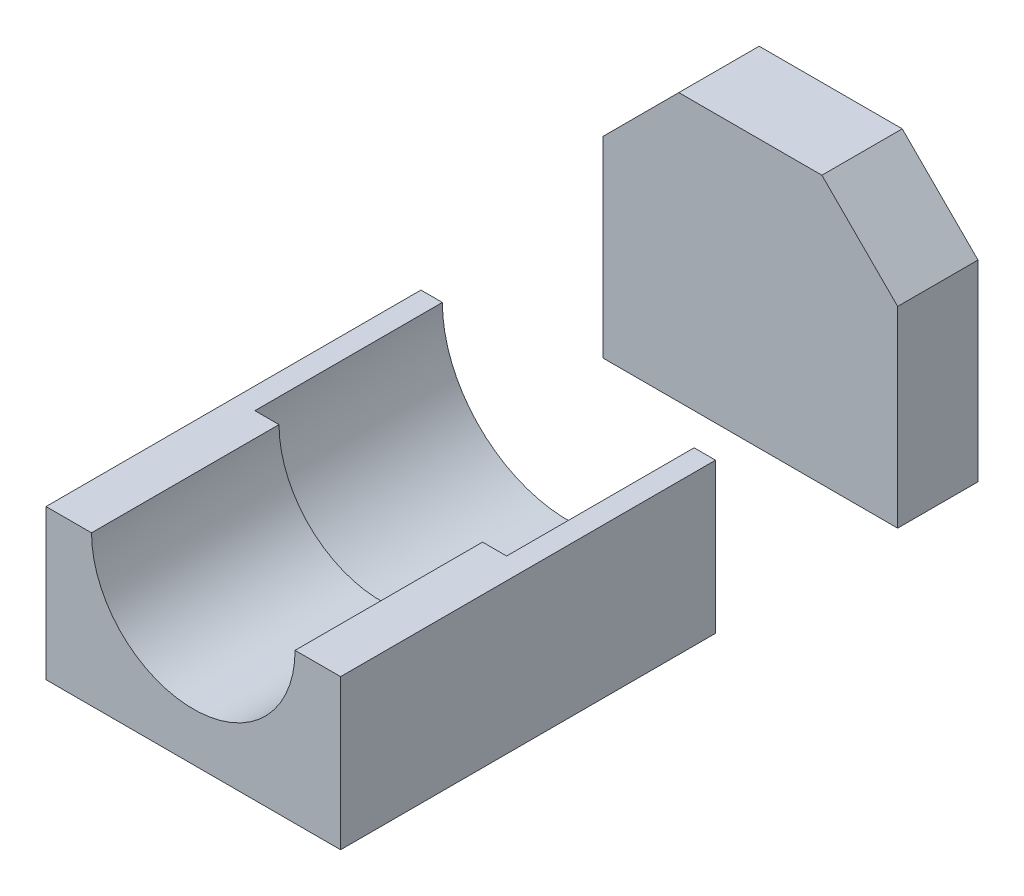
ISO-10303-21;
HEADER;
FILE_DESCRIPTION(('STEP AP214'),'2;1');
FILE_NAME('part.step','',(''),(''),'','','');
FILE_SCHEMA(('AUTOMOTIVE_DESIGN { 1 0 10303 214 1 1 1 1 }'));
ENDSEC;
DATA;
#1=APPLICATION_CONTEXT('core data for automotive mechanical design processes');
#2=APPLICATION_PROTOCOL_DEFINITION('international standard','automotive_design',2000,#1);
#3=PRODUCT_CONTEXT('',#1,'mechanical');
#4=PRODUCT('Part','Part','',(#3));
#5=PRODUCT_RELATED_PRODUCT_CATEGORY('part','',(#4));
#6=PRODUCT_DEFINITION_FORMATION('','',#4);
#7=PRODUCT_DEFINITION_CONTEXT('part definition',#1,'design');
#8=PRODUCT_DEFINITION('design','',#6,#7);
#9=PRODUCT_DEFINITION_SHAPE('','',#8);
#10=(LENGTH_UNIT() NAMED_UNIT(*) SI_UNIT(.MILLI.,.METRE.));
#11=(NAMED_UNIT(*) PLANE_ANGLE_UNIT() SI_UNIT($,.RADIAN.));
#12=(NAMED_UNIT(*) SI_UNIT($,.STERADIAN.) SOLID_ANGLE_UNIT());
#13=UNCERTAINTY_MEASURE_WITH_UNIT(LENGTH_MEASURE(1.E-05),#10,'distance_accuracy_value','');
#14=(GEOMETRIC_REPRESENTATION_CONTEXT(3) GLOBAL_UNCERTAINTY_ASSIGNED_CONTEXT((#13)) GLOBAL_UNIT_ASSIGNED_CONTEXT((#10,
#11,#12)) REPRESENTATION_CONTEXT('',''));
#15=CARTESIAN_POINT('',(0.,0.,0.));
#16=DIRECTION('',(0.,0.,1.));
#17=DIRECTION('',(1.,0.,0.));
#18=AXIS2_PLACEMENT_3D('',#15,#16,#17);
#19=CARTESIAN_POINT('',(44.7489418291473,23.7901192371777,-49.));
#20=DIRECTION('',(1.,0.,0.));
#21=DIRECTION('',(0.,0.,-1.));
#22=AXIS2_PLACEMENT_3D('',#19,#20,#21);
#23=PLANE('',#22);
#24=DIRECTION('',(0.,1.,0.));
#25=VECTOR('',#24,1.);
#26=CARTESIAN_POINT('',(44.7489418291473,23.7901192371777,-34.));
#27=LINE('',#26,#25);
#28=CARTESIAN_POINT('',(44.7489418291473,-12.0677451390913,-34.));
#29=VERTEX_POINT('',#28);
#30=CARTESIAN_POINT('',(44.7489418291473,23.7901192371777,-34.));
#31=VERTEX_POINT('',#30);
#32=EDGE_CURVE('E137',#29,#31,#27,.T.);
#33=ORIENTED_EDGE('',*,*,#32,.T.);
#34=DIRECTION('',(0.,0.,1.));
#35=VECTOR('',#34,1.);
#36=CARTESIAN_POINT('',(44.7489418291473,23.7901192371777,-49.));
#37=LINE('',#36,#35);
#38=CARTESIAN_POINT('',(44.7489418291473,23.7901192371777,-49.));
#39=VERTEX_POINT('',#38);
#40=EDGE_CURVE('E57',#39,#31,#37,.T.);
#41=ORIENTED_EDGE('',*,*,#40,.F.);
#42=DIRECTION('',(0.,1.,0.));
#43=VECTOR('',#42,1.);
#44=CARTESIAN_POINT('',(44.7489418291473,23.7901192371777,-49.));
#45=LINE('',#44,#43);
#46=CARTESIAN_POINT('',(44.7489418291473,-12.0677451390913,-49.));
#47=VERTEX_POINT('',#46);
#48=EDGE_CURVE('E103',#47,#39,#45,.T.);
#49=ORIENTED_EDGE('',*,*,#48,.F.);
#50=DIRECTION('',(0.,0.,1.));
#51=VECTOR('',#50,1.);
#52=CARTESIAN_POINT('',(44.7489418291473,-12.0677451390913,-49.));
#53=LINE('',#52,#51);
#54=EDGE_CURVE('E12',#47,#29,#53,.T.);
#55=ORIENTED_EDGE('',*,*,#54,.T.);
#56=EDGE_LOOP('',(#33,#41,#49,#55));
#57=FACE_BOUND('',#56,.T.);
#58=ADVANCED_FACE('F49',(#57),#23,.F.);
#59=CARTESIAN_POINT('',(58.8910774528783,37.9322548609087,-49.));
#60=DIRECTION('',(0.707106781186546,-0.707106781186549,0.));
#61=DIRECTION('',(0.707106781186549,0.707106781186546,0.));
#62=AXIS2_PLACEMENT_3D('',#59,#60,#61);
#63=PLANE('',#62);
#64=DIRECTION('',(0.707106781186549,0.707106781186546,0.));
#65=VECTOR('',#64,1.);
#66=CARTESIAN_POINT('',(58.8910774528783,37.9322548609087,-34.));
#67=LINE('',#66,#65);
#68=CARTESIAN_POINT('',(58.8910774528783,37.9322548609087,-34.));
#69=VERTEX_POINT('',#68);
#70=EDGE_CURVE('E139',#31,#69,#67,.T.);
#71=ORIENTED_EDGE('',*,*,#70,.T.);
#72=DIRECTION('',(0.,0.,1.));
#73=VECTOR('',#72,1.);
#74=CARTESIAN_POINT('',(58.8910774528783,37.9322548609087,-49.));
#75=LINE('',#74,#73);
#76=CARTESIAN_POINT('',(58.8910774528783,37.9322548609087,-49.));
#77=VERTEX_POINT('',#76);
#78=EDGE_CURVE('E126',#77,#69,#75,.T.);
#79=ORIENTED_EDGE('',*,*,#78,.F.);
#80=DIRECTION('',(0.707106781186549,0.707106781186546,0.));
#81=VECTOR('',#80,1.);
#82=CARTESIAN_POINT('',(58.8910774528783,37.9322548609087,-49.));
#83=LINE('',#82,#81);
#84=EDGE_CURVE('E117',#39,#77,#83,.T.);
#85=ORIENTED_EDGE('',*,*,#84,.F.);
#86=ORIENTED_EDGE('',*,*,#40,.T.);
#87=EDGE_LOOP('',(#71,#79,#85,#86));
#88=FACE_BOUND('',#87,.T.);
#89=ADVANCED_FACE('F151',(#88),#63,.F.);
#90=CARTESIAN_POINT('',(85.6068062054163,37.9322548609087,-49.));
#91=DIRECTION('',(0.,-1.,0.));
#92=DIRECTION('',(0.,0.,-1.));
#93=AXIS2_PLACEMENT_3D('',#90,#91,#92);
#94=PLANE('',#93);
#95=DIRECTION('',(1.,0.,0.));
#96=VECTOR('',#95,1.);
#97=CARTESIAN_POINT('',(85.6068062054163,37.9322548609087,-34.));
#98=LINE('',#97,#96);
#99=CARTESIAN_POINT('',(85.6068062054163,37.9322548609087,-34.));
#100=VERTEX_POINT('',#99);
#101=EDGE_CURVE('E125',#69,#100,#98,.T.);
#102=ORIENTED_EDGE('',*,*,#101,.T.);
#103=DIRECTION('',(0.,0.,1.));
#104=VECTOR('',#103,1.);
#105=CARTESIAN_POINT('',(85.6068062054163,37.9322548609087,-49.));
#106=LINE('',#105,#104);
#107=CARTESIAN_POINT('',(85.6068062054163,37.9322548609087,-49.));
#108=VERTEX_POINT('',#107);
#109=EDGE_CURVE('E122',#108,#100,#106,.T.);
#110=ORIENTED_EDGE('',*,*,#109,.F.);
#111=DIRECTION('',(1.,0.,0.));
#112=VECTOR('',#111,1.);
#113=CARTESIAN_POINT('',(85.6068062054163,37.9322548609087,-49.));
#114=LINE('',#113,#112);
#115=EDGE_CURVE('E111',#77,#108,#114,.T.);
#116=ORIENTED_EDGE('',*,*,#115,.F.);
#117=ORIENTED_EDGE('',*,*,#78,.T.);
#118=EDGE_LOOP('',(#102,#110,#116,#117));
#119=FACE_BOUND('',#118,.T.);
#120=ADVANCED_FACE('F123',(#119),#94,.F.);
#121=CARTESIAN_POINT('',(99.7489418291473,23.7901192371777,-49.));
#122=DIRECTION('',(-0.707106781186546,-0.707106781186549,0.));
#123=DIRECTION('',(0.707106781186549,-0.707106781186546,0.));
#124=AXIS2_PLACEMENT_3D('',#121,#122,#123);
#125=PLANE('',#124);
#126=DIRECTION('',(0.707106781186549,-0.707106781186545,0.));
#127=VECTOR('',#126,1.);
#128=CARTESIAN_POINT('',(99.7489418291473,23.7901192371777,-34.));
#129=LINE('',#128,#127);
#130=CARTESIAN_POINT('',(99.7489418291473,23.7901192371777,-34.));
#131=VERTEX_POINT('',#130);
#132=EDGE_CURVE('E89',#100,#131,#129,.T.);
#133=ORIENTED_EDGE('',*,*,#132,.T.);
#134=DIRECTION('',(0.,0.,1.));
#135=VECTOR('',#134,1.);
#136=CARTESIAN_POINT('',(99.7489418291473,23.7901192371777,-49.));
#137=LINE('',#136,#135);
#138=CARTESIAN_POINT('',(99.7489418291473,23.7901192371777,-49.));
#139=VERTEX_POINT('',#138);
#140=EDGE_CURVE('E127',#139,#131,#137,.T.);
#141=ORIENTED_EDGE('',*,*,#140,.F.);
#142=DIRECTION('',(0.707106781186549,-0.707106781186545,0.));
#143=VECTOR('',#142,1.);
#144=CARTESIAN_POINT('',(99.7489418291473,23.7901192371777,-49.));
#145=LINE('',#144,#143);
#146=EDGE_CURVE('E115',#108,#139,#145,.T.);
#147=ORIENTED_EDGE('',*,*,#146,.F.);
#148=ORIENTED_EDGE('',*,*,#109,.T.);
#149=EDGE_LOOP('',(#133,#141,#147,#148));
#150=FACE_BOUND('',#149,.T.);
#151=ADVANCED_FACE('F129',(#150),#125,.F.);
#152=CARTESIAN_POINT('',(99.7489418291473,-12.0677451390913,-49.));
#153=DIRECTION('',(-1.,0.,0.));
#154=DIRECTION('',(0.,0.,1.));
#155=AXIS2_PLACEMENT_3D('',#152,#153,#154);
#156=PLANE('',#155);
#157=DIRECTION('',(0.,-1.,0.));
#158=VECTOR('',#157,1.);
#159=CARTESIAN_POINT('',(99.7489418291473,-12.0677451390913,-34.));
#160=LINE('',#159,#158);
#161=CARTESIAN_POINT('',(99.7489418291473,-12.0677451390913,-34.));
#162=VERTEX_POINT('',#161);
#163=EDGE_CURVE('E96',#131,#162,#160,.T.);
#164=ORIENTED_EDGE('',*,*,#163,.T.);
#165=DIRECTION('',(0.,0.,1.));
#166=VECTOR('',#165,1.);
#167=CARTESIAN_POINT('',(99.7489418291473,-12.0677451390913,-49.));
#168=LINE('',#167,#166);
#169=CARTESIAN_POINT('',(99.7489418291473,-12.0677451390913,-49.));
#170=VERTEX_POINT('',#169);
#171=EDGE_CURVE('E133',#170,#162,#168,.T.);
#172=ORIENTED_EDGE('',*,*,#171,.F.);
#173=DIRECTION('',(0.,-1.,0.));
#174=VECTOR('',#173,1.);
#175=CARTESIAN_POINT('',(99.7489418291473,-12.0677451390913,-49.));
#176=LINE('',#175,#174);
#177=EDGE_CURVE('E131',#139,#170,#176,.T.);
#178=ORIENTED_EDGE('',*,*,#177,.F.);
#179=ORIENTED_EDGE('',*,*,#140,.T.);
#180=EDGE_LOOP('',(#164,#172,#178,#179));
#181=FACE_BOUND('',#180,.T.);
#182=ADVANCED_FACE('F157',(#181),#156,.F.);
#183=CARTESIAN_POINT('',(46.4162897695382,-12.0677451390913,-49.));
#184=DIRECTION('',(0.,1.,0.));
#185=DIRECTION('',(-1.,0.,0.));
#186=AXIS2_PLACEMENT_3D('',#183,#184,#185);
#187=PLANE('',#186);
#188=DIRECTION('',(-1.,0.,0.));
#189=VECTOR('',#188,1.);
#190=CARTESIAN_POINT('',(46.4162897695382,-12.0677451390913,-34.));
#191=LINE('',#190,#189);
#192=EDGE_CURVE('E144',#162,#29,#191,.T.);
#193=ORIENTED_EDGE('',*,*,#192,.T.);
#194=ORIENTED_EDGE('',*,*,#54,.F.);
#195=DIRECTION('',(-1.,0.,0.));
#196=VECTOR('',#195,1.);
#197=CARTESIAN_POINT('',(44.7489418291473,-12.0677451390913,-49.));
#198=LINE('',#197,#196);
#199=EDGE_CURVE('E65',#170,#47,#198,.T.);
#200=ORIENTED_EDGE('',*,*,#199,.F.);
#201=ORIENTED_EDGE('',*,*,#171,.T.);
#202=EDGE_LOOP('',(#193,#194,#200,#201));
#203=FACE_BOUND('',#202,.T.);
#204=ADVANCED_FACE('F156',(#203),#187,.F.);
#205=CARTESIAN_POINT('',(0.,0.,-49.));
#206=DIRECTION('',(0.,0.,1.));
#207=DIRECTION('',(1.,0.,0.));
#208=AXIS2_PLACEMENT_3D('',#205,#206,#207);
#209=PLANE('',#208);
#210=ORIENTED_EDGE('',*,*,#199,.T.);
#211=ORIENTED_EDGE('',*,*,#48,.T.);
#212=ORIENTED_EDGE('',*,*,#84,.T.);
#213=ORIENTED_EDGE('',*,*,#115,.T.);
#214=ORIENTED_EDGE('',*,*,#146,.T.);
#215=ORIENTED_EDGE('',*,*,#177,.T.);
#216=EDGE_LOOP('',(#210,#211,#212,#213,#214,#215));
#217=FACE_BOUND('',#216,.T.);
#218=ADVANCED_FACE('F113',(#217),#209,.F.);
#219=CARTESIAN_POINT('',(0.,0.,-34.));
#220=DIRECTION('',(0.,0.,1.));
#221=DIRECTION('',(1.,0.,0.));
#222=AXIS2_PLACEMENT_3D('',#219,#220,#221);
#223=PLANE('',#222);
#224=ORIENTED_EDGE('',*,*,#32,.F.);
#225=ORIENTED_EDGE('',*,*,#192,.F.);
#226=ORIENTED_EDGE('',*,*,#163,.F.);
#227=ORIENTED_EDGE('',*,*,#132,.F.);
#228=ORIENTED_EDGE('',*,*,#101,.F.);
#229=ORIENTED_EDGE('',*,*,#70,.F.);
#230=EDGE_LOOP('',(#224,#225,#226,#227,#228,#229));
#231=FACE_BOUND('',#230,.T.);
#232=ADVANCED_FACE('F154',(#231),#223,.T.);
#233=CLOSED_SHELL('',(#58,#89,#120,#151,#182,#204,#218,#232));
#234=MANIFOLD_SOLID_BREP('B2',#233);
#235=CARTESIAN_POINT('',(72.2489418291473,15.9322548609087,35.));
#236=DIRECTION('',(0.,0.,-1.));
#237=DIRECTION('',(-1.,0.,0.));
#238=AXIS2_PLACEMENT_3D('',#235,#236,#237);
#239=CYLINDRICAL_SURFACE('',#238,23.5);
#240=CARTESIAN_POINT('',(72.2489418291473,15.9322548609087,0.));
#241=DIRECTION('',(0.,0.,-1.));
#242=DIRECTION('',(-1.,0.,0.));
#243=AXIS2_PLACEMENT_3D('',#240,#241,#242);
#244=CIRCLE('',#243,23.5);
#245=CARTESIAN_POINT('',(95.7489418291473,15.9322548609085,0.));
#246=VERTEX_POINT('',#245);
#247=CARTESIAN_POINT('',(48.7489418291473,15.9322548609087,0.));
#248=VERTEX_POINT('',#247);
#249=EDGE_CURVE('E290',#246,#248,#244,.T.);
#250=ORIENTED_EDGE('',*,*,#249,.T.);
#251=DIRECTION('',(0.,0.,-1.));
#252=VECTOR('',#251,1.);
#253=CARTESIAN_POINT('',(48.7489418291473,15.9322548609087,35.));
#254=LINE('',#253,#252);
#255=CARTESIAN_POINT('',(48.7489418291473,15.9322548609087,35.));
#256=VERTEX_POINT('',#255);
#257=EDGE_CURVE('E47',#256,#248,#254,.T.);
#258=ORIENTED_EDGE('',*,*,#257,.F.);
#259=CARTESIAN_POINT('',(72.2489418291473,15.9322548609087,35.));
#260=DIRECTION('',(0.,0.,-1.));
#261=DIRECTION('',(-1.,0.,0.));
#262=AXIS2_PLACEMENT_3D('',#259,#260,#261);
#263=CIRCLE('',#262,23.5);
#264=CARTESIAN_POINT('',(95.7489418291473,15.9322548609085,35.));
#265=VERTEX_POINT('',#264);
#266=EDGE_CURVE('E291',#265,#256,#263,.T.);
#267=ORIENTED_EDGE('',*,*,#266,.F.);
#268=DIRECTION('',(0.,0.,-1.));
#269=VECTOR('',#268,1.);
#270=CARTESIAN_POINT('',(95.7489418291473,15.9322548609085,35.));
#271=LINE('',#270,#269);
#272=EDGE_CURVE('E243',#265,#246,#271,.T.);
#273=ORIENTED_EDGE('',*,*,#272,.T.);
#274=EDGE_LOOP('',(#250,#258,#267,#273));
#275=FACE_BOUND('',#274,.T.);
#276=ADVANCED_FACE('F228',(#275),#239,.F.);
#277=CARTESIAN_POINT('',(48.7489418291473,15.9322548609087,35.));
#278=DIRECTION('',(0.,-1.,0.));
#279=DIRECTION('',(0.,0.,-1.));
#280=AXIS2_PLACEMENT_3D('',#277,#278,#279);
#281=PLANE('',#280);
#282=DIRECTION('',(-1.,0.,0.));
#283=VECTOR('',#282,1.);
#284=CARTESIAN_POINT('',(48.7489418291473,15.9322548609087,0.));
#285=LINE('',#284,#283);
#286=CARTESIAN_POINT('',(44.7489418291473,15.9322548609087,0.));
#287=VERTEX_POINT('',#286);
#288=EDGE_CURVE('E315',#248,#287,#285,.T.);
#289=ORIENTED_EDGE('',*,*,#288,.T.);
#290=DIRECTION('',(0.,0.,-1.));
#291=VECTOR('',#290,1.);
#292=CARTESIAN_POINT('',(44.7489418291473,15.9322548609087,35.));
#293=LINE('',#292,#291);
#294=CARTESIAN_POINT('',(44.7489418291473,15.9322548609087,70.));
#295=VERTEX_POINT('',#294);
#296=EDGE_CURVE('E236',#295,#287,#293,.T.);
#297=ORIENTED_EDGE('',*,*,#296,.F.);
#298=DIRECTION('',(-1.,0.,0.));
#299=VECTOR('',#298,1.);
#300=CARTESIAN_POINT('',(44.7489418291473,15.9322548609087,70.));
#301=LINE('',#300,#299);
#302=CARTESIAN_POINT('',(53.2489418291473,15.9322548609087,70.));
#303=VERTEX_POINT('',#302);
#304=EDGE_CURVE('E342',#303,#295,#301,.T.);
#305=ORIENTED_EDGE('',*,*,#304,.F.);
#306=DIRECTION('',(0.,0.,-1.));
#307=VECTOR('',#306,1.);
#308=CARTESIAN_POINT('',(53.2489418291473,15.9322548609087,70.));
#309=LINE('',#308,#307);
#310=CARTESIAN_POINT('',(53.2489418291473,15.9322548609087,35.));
#311=VERTEX_POINT('',#310);
#312=EDGE_CURVE('E319',#303,#311,#309,.T.);
#313=ORIENTED_EDGE('',*,*,#312,.T.);
#314=DIRECTION('',(-1.,0.,0.));
#315=VECTOR('',#314,1.);
#316=CARTESIAN_POINT('',(44.7489418291473,15.9322548609087,35.));
#317=LINE('',#316,#315);
#318=EDGE_CURVE('E329',#311,#256,#317,.T.);
#319=ORIENTED_EDGE('',*,*,#318,.T.);
#320=ORIENTED_EDGE('',*,*,#257,.T.);
#321=EDGE_LOOP('',(#289,#297,#305,#313,#319,#320));
#322=FACE_BOUND('',#321,.T.);
#323=ADVANCED_FACE('F357',(#322),#281,.F.);
#324=CARTESIAN_POINT('',(44.7489418291473,15.9322548609087,35.));
#325=DIRECTION('',(1.,0.,0.));
#326=DIRECTION('',(0.,0.,-1.));
#327=AXIS2_PLACEMENT_3D('',#324,#325,#326);
#328=PLANE('',#327);
#329=DIRECTION('',(0.,-1.,0.));
#330=VECTOR('',#329,1.);
#331=CARTESIAN_POINT('',(44.7489418291473,15.9322548609087,0.));
#332=LINE('',#331,#330);
#333=CARTESIAN_POINT('',(44.7489418291473,-12.0677451390913,0.));
#334=VERTEX_POINT('',#333);
#335=EDGE_CURVE('E308',#287,#334,#332,.T.);
#336=ORIENTED_EDGE('',*,*,#335,.T.);
#337=DIRECTION('',(0.,0.,-1.));
#338=VECTOR('',#337,1.);
#339=CARTESIAN_POINT('',(44.7489418291473,-12.0677451390913,35.));
#340=LINE('',#339,#338);
#341=CARTESIAN_POINT('',(44.7489418291473,-12.0677451390913,70.));
#342=VERTEX_POINT('',#341);
#343=EDGE_CURVE('E299',#342,#334,#340,.T.);
#344=ORIENTED_EDGE('',*,*,#343,.F.);
#345=DIRECTION('',(0.,-1.,0.));
#346=VECTOR('',#345,1.);
#347=CARTESIAN_POINT('',(44.7489418291473,-12.0677451390913,70.));
#348=LINE('',#347,#346);
#349=EDGE_CURVE('E311',#295,#342,#348,.T.);
#350=ORIENTED_EDGE('',*,*,#349,.F.);
#351=ORIENTED_EDGE('',*,*,#296,.T.);
#352=EDGE_LOOP('',(#336,#344,#350,#351));
#353=FACE_BOUND('',#352,.T.);
#354=ADVANCED_FACE('F306',(#353),#328,.F.);
#355=CARTESIAN_POINT('',(44.7489418291473,-12.0677451390913,35.));
#356=DIRECTION('',(0.,1.,0.));
#357=DIRECTION('',(-1.,0.,0.));
#358=AXIS2_PLACEMENT_3D('',#355,#356,#357);
#359=PLANE('',#358);
#360=DIRECTION('',(1.,0.,0.));
#361=VECTOR('',#360,1.);
#362=CARTESIAN_POINT('',(44.7489418291473,-12.0677451390913,0.));
#363=LINE('',#362,#361);
#364=CARTESIAN_POINT('',(99.7489418291473,-12.0677451390913,0.));
#365=VERTEX_POINT('',#364);
#366=EDGE_CURVE('E279',#334,#365,#363,.T.);
#367=ORIENTED_EDGE('',*,*,#366,.T.);
#368=DIRECTION('',(0.,0.,-1.));
#369=VECTOR('',#368,1.);
#370=CARTESIAN_POINT('',(99.7489418291473,-12.0677451390913,35.));
#371=LINE('',#370,#369);
#372=CARTESIAN_POINT('',(99.7489418291473,-12.0677451390913,70.));
#373=VERTEX_POINT('',#372);
#374=EDGE_CURVE('E274',#373,#365,#371,.T.);
#375=ORIENTED_EDGE('',*,*,#374,.F.);
#376=DIRECTION('',(1.,0.,0.));
#377=VECTOR('',#376,1.);
#378=CARTESIAN_POINT('',(99.7489418291473,-12.0677451390913,70.));
#379=LINE('',#378,#377);
#380=EDGE_CURVE('E338',#342,#373,#379,.T.);
#381=ORIENTED_EDGE('',*,*,#380,.F.);
#382=ORIENTED_EDGE('',*,*,#343,.T.);
#383=EDGE_LOOP('',(#367,#375,#381,#382));
#384=FACE_BOUND('',#383,.T.);
#385=ADVANCED_FACE('F370',(#384),#359,.F.);
#386=CARTESIAN_POINT('',(99.7489418291473,-12.0677451390913,35.));
#387=DIRECTION('',(-1.,0.,0.));
#388=DIRECTION('',(0.,0.,1.));
#389=AXIS2_PLACEMENT_3D('',#386,#387,#388);
#390=PLANE('',#389);
#391=DIRECTION('',(0.,1.,0.));
#392=VECTOR('',#391,1.);
#393=CARTESIAN_POINT('',(99.7489418291473,-12.0677451390913,0.));
#394=LINE('',#393,#392);
#395=CARTESIAN_POINT('',(99.7489418291473,15.9322548609085,0.));
#396=VERTEX_POINT('',#395);
#397=EDGE_CURVE('E266',#365,#396,#394,.T.);
#398=ORIENTED_EDGE('',*,*,#397,.T.);
#399=DIRECTION('',(0.,0.,-1.));
#400=VECTOR('',#399,1.);
#401=CARTESIAN_POINT('',(99.7489418291473,15.9322548609085,35.));
#402=LINE('',#401,#400);
#403=CARTESIAN_POINT('',(99.7489418291473,15.9322548609085,70.));
#404=VERTEX_POINT('',#403);
#405=EDGE_CURVE('E271',#404,#396,#402,.T.);
#406=ORIENTED_EDGE('',*,*,#405,.F.);
#407=DIRECTION('',(0.,1.,0.));
#408=VECTOR('',#407,1.);
#409=CARTESIAN_POINT('',(99.7489418291473,15.9322548609085,70.));
#410=LINE('',#409,#408);
#411=EDGE_CURVE('E336',#373,#404,#410,.T.);
#412=ORIENTED_EDGE('',*,*,#411,.F.);
#413=ORIENTED_EDGE('',*,*,#374,.T.);
#414=EDGE_LOOP('',(#398,#406,#412,#413));
#415=FACE_BOUND('',#414,.T.);
#416=ADVANCED_FACE('F268',(#415),#390,.F.);
#417=CARTESIAN_POINT('',(99.7489418291473,15.9322548609085,35.));
#418=DIRECTION('',(0.,-1.,0.));
#419=DIRECTION('',(1.,0.,0.));
#420=AXIS2_PLACEMENT_3D('',#417,#418,#419);
#421=PLANE('',#420);
#422=DIRECTION('',(-1.,0.,0.));
#423=VECTOR('',#422,1.);
#424=CARTESIAN_POINT('',(99.7489418291473,15.9322548609085,0.));
#425=LINE('',#424,#423);
#426=EDGE_CURVE('E278',#396,#246,#425,.T.);
#427=ORIENTED_EDGE('',*,*,#426,.T.);
#428=ORIENTED_EDGE('',*,*,#272,.F.);
#429=DIRECTION('',(-1.,0.,0.));
#430=VECTOR('',#429,1.);
#431=CARTESIAN_POINT('',(91.2489418291473,15.9322548609087,35.));
#432=LINE('',#431,#430);
#433=CARTESIAN_POINT('',(91.2489418291473,15.9322548609087,35.));
#434=VERTEX_POINT('',#433);
#435=EDGE_CURVE('E326',#265,#434,#432,.T.);
#436=ORIENTED_EDGE('',*,*,#435,.T.);
#437=DIRECTION('',(0.,0.,-1.));
#438=VECTOR('',#437,1.);
#439=CARTESIAN_POINT('',(91.2489418291473,15.9322548609087,70.));
#440=LINE('',#439,#438);
#441=CARTESIAN_POINT('',(91.2489418291473,15.9322548609087,70.));
#442=VERTEX_POINT('',#441);
#443=EDGE_CURVE('E323',#442,#434,#440,.T.);
#444=ORIENTED_EDGE('',*,*,#443,.F.);
#445=DIRECTION('',(-1.,0.,0.));
#446=VECTOR('',#445,1.);
#447=CARTESIAN_POINT('',(91.2489418291473,15.9322548609087,70.));
#448=LINE('',#447,#446);
#449=EDGE_CURVE('E285',#404,#442,#448,.T.);
#450=ORIENTED_EDGE('',*,*,#449,.F.);
#451=ORIENTED_EDGE('',*,*,#405,.T.);
#452=EDGE_LOOP('',(#427,#428,#436,#444,#450,#451));
#453=FACE_BOUND('',#452,.T.);
#454=ADVANCED_FACE('F282',(#453),#421,.F.);
#455=CARTESIAN_POINT('',(72.2489418291473,15.9322548609087,0.));
#456=DIRECTION('',(0.,0.,-1.));
#457=DIRECTION('',(-1.,0.,0.));
#458=AXIS2_PLACEMENT_3D('',#455,#456,#457);
#459=PLANE('',#458);
#460=ORIENTED_EDGE('',*,*,#249,.F.);
#461=ORIENTED_EDGE('',*,*,#426,.F.);
#462=ORIENTED_EDGE('',*,*,#397,.F.);
#463=ORIENTED_EDGE('',*,*,#366,.F.);
#464=ORIENTED_EDGE('',*,*,#335,.F.);
#465=ORIENTED_EDGE('',*,*,#288,.F.);
#466=EDGE_LOOP('',(#460,#461,#462,#463,#464,#465));
#467=FACE_BOUND('',#466,.T.);
#468=ADVANCED_FACE('F288',(#467),#459,.T.);
#469=CARTESIAN_POINT('',(72.2489418291473,15.9322548609087,35.));
#470=DIRECTION('',(0.,0.,-1.));
#471=DIRECTION('',(-1.,0.,0.));
#472=AXIS2_PLACEMENT_3D('',#469,#470,#471);
#473=PLANE('',#472);
#474=ORIENTED_EDGE('',*,*,#435,.F.);
#475=ORIENTED_EDGE('',*,*,#266,.T.);
#476=ORIENTED_EDGE('',*,*,#318,.F.);
#477=CARTESIAN_POINT('',(72.2489418291473,15.9322548609087,35.));
#478=DIRECTION('',(0.,0.,-1.));
#479=DIRECTION('',(-1.,0.,0.));
#480=AXIS2_PLACEMENT_3D('',#477,#478,#479);
#481=CIRCLE('',#480,19.);
#482=EDGE_CURVE('E332',#434,#311,#481,.T.);
#483=ORIENTED_EDGE('',*,*,#482,.F.);
#484=EDGE_LOOP('',(#474,#475,#476,#483));
#485=FACE_BOUND('',#484,.T.);
#486=ADVANCED_FACE('F386',(#485),#473,.T.);
#487=CARTESIAN_POINT('',(72.2489418291473,15.9322548609087,70.));
#488=DIRECTION('',(0.,0.,-1.));
#489=DIRECTION('',(-1.,0.,0.));
#490=AXIS2_PLACEMENT_3D('',#487,#488,#489);
#491=CYLINDRICAL_SURFACE('',#490,19.);
#492=ORIENTED_EDGE('',*,*,#482,.T.);
#493=ORIENTED_EDGE('',*,*,#312,.F.);
#494=CARTESIAN_POINT('',(72.2489418291473,15.9322548609087,70.));
#495=DIRECTION('',(0.,0.,-1.));
#496=DIRECTION('',(-1.,0.,0.));
#497=AXIS2_PLACEMENT_3D('',#494,#495,#496);
#498=CIRCLE('',#497,19.);
#499=EDGE_CURVE('E328',#442,#303,#498,.T.);
#500=ORIENTED_EDGE('',*,*,#499,.F.);
#501=ORIENTED_EDGE('',*,*,#443,.T.);
#502=EDGE_LOOP('',(#492,#493,#500,#501));
#503=FACE_BOUND('',#502,.T.);
#504=ADVANCED_FACE('F354',(#503),#491,.F.);
#505=CARTESIAN_POINT('',(72.2489418291473,15.9322548609087,70.));
#506=DIRECTION('',(0.,0.,-1.));
#507=DIRECTION('',(-1.,0.,0.));
#508=AXIS2_PLACEMENT_3D('',#505,#506,#507);
#509=PLANE('',#508);
#510=ORIENTED_EDGE('',*,*,#499,.T.);
#511=ORIENTED_EDGE('',*,*,#304,.T.);
#512=ORIENTED_EDGE('',*,*,#349,.T.);
#513=ORIENTED_EDGE('',*,*,#380,.T.);
#514=ORIENTED_EDGE('',*,*,#411,.T.);
#515=ORIENTED_EDGE('',*,*,#449,.T.);
#516=EDGE_LOOP('',(#510,#511,#512,#513,#514,#515));
#517=FACE_BOUND('',#516,.T.);
#518=ADVANCED_FACE('F349',(#517),#509,.F.);
#519=CLOSED_SHELL('',(#276,#323,#354,#385,#416,#454,#468,#486,#504,#518));
#520=MANIFOLD_SOLID_BREP('B6',#519);
#521=ADVANCED_BREP_SHAPE_REPRESENTATION('',(#18,#234,#520),#14);
#522=SHAPE_DEFINITION_REPRESENTATION(#9,#521);
ENDSEC;
END-ISO-10303-21;
